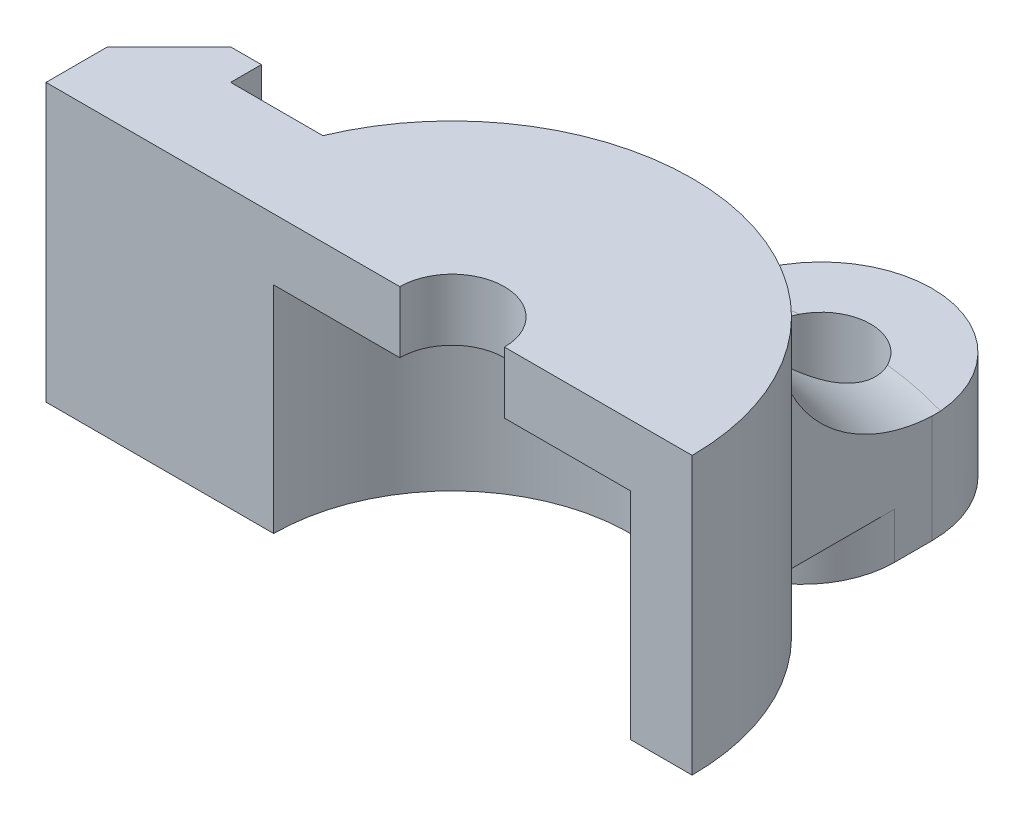
ISO-10303-21;
HEADER;
FILE_DESCRIPTION(('STEP AP214'),'2;1');
FILE_NAME('part.step','',(''),(''),'','','');
FILE_SCHEMA(('AUTOMOTIVE_DESIGN { 1 0 10303 214 1 1 1 1 }'));
ENDSEC;
DATA;
#1=APPLICATION_CONTEXT('core data for automotive mechanical design processes');
#2=APPLICATION_PROTOCOL_DEFINITION('international standard','automotive_design',2000,#1);
#3=PRODUCT_CONTEXT('',#1,'mechanical');
#4=PRODUCT('Part','Part','',(#3));
#5=PRODUCT_RELATED_PRODUCT_CATEGORY('part','',(#4));
#6=PRODUCT_DEFINITION_FORMATION('','',#4);
#7=PRODUCT_DEFINITION_CONTEXT('part definition',#1,'design');
#8=PRODUCT_DEFINITION('design','',#6,#7);
#9=PRODUCT_DEFINITION_SHAPE('','',#8);
#10=(LENGTH_UNIT() NAMED_UNIT(*) SI_UNIT(.MILLI.,.METRE.));
#11=(NAMED_UNIT(*) PLANE_ANGLE_UNIT() SI_UNIT($,.RADIAN.));
#12=(NAMED_UNIT(*) SI_UNIT($,.STERADIAN.) SOLID_ANGLE_UNIT());
#13=UNCERTAINTY_MEASURE_WITH_UNIT(LENGTH_MEASURE(1.E-05),#10,'distance_accuracy_value','');
#14=(GEOMETRIC_REPRESENTATION_CONTEXT(3) GLOBAL_UNCERTAINTY_ASSIGNED_CONTEXT((#13)) GLOBAL_UNIT_ASSIGNED_CONTEXT((#10,
#11,#12)) REPRESENTATION_CONTEXT('',''));
#15=CARTESIAN_POINT('',(0.,0.,0.));
#16=DIRECTION('',(0.,0.,1.));
#17=DIRECTION('',(1.,0.,0.));
#18=AXIS2_PLACEMENT_3D('',#15,#16,#17);
#19=CARTESIAN_POINT('',(0.,7.,0.));
#20=DIRECTION('',(0.,-1.,0.));
#21=DIRECTION('',(0.,0.,-1.));
#22=AXIS2_PLACEMENT_3D('',#19,#20,#21);
#23=CYLINDRICAL_SURFACE('',#22,7.8);
#24=CARTESIAN_POINT('',(0.,0.,0.));
#25=DIRECTION('',(0.,1.,0.));
#26=DIRECTION('',(0.,0.,1.));
#27=AXIS2_PLACEMENT_3D('',#24,#25,#26);
#28=CIRCLE('',#27,7.8);
#29=CARTESIAN_POINT('',(-3.6,0.,-6.91953755680248));
#30=VERTEX_POINT('',#29);
#31=CARTESIAN_POINT('',(-7.2,0.,-3.));
#32=VERTEX_POINT('',#31);
#33=EDGE_CURVE('E206',#30,#32,#28,.T.);
#34=ORIENTED_EDGE('',*,*,#33,.T.);
#35=DIRECTION('',(0.,1.,0.));
#36=VECTOR('',#35,1.);
#37=CARTESIAN_POINT('',(-7.2,-7.21110255092798,-3.));
#38=LINE('',#37,#36);
#39=CARTESIAN_POINT('',(-7.2,9.,-3.));
#40=VERTEX_POINT('',#39);
#41=EDGE_CURVE('E191',#32,#40,#38,.T.);
#42=ORIENTED_EDGE('',*,*,#41,.T.);
#43=CARTESIAN_POINT('',(0.,9.,0.));
#44=DIRECTION('',(0.,1.,0.));
#45=DIRECTION('',(0.,0.,1.));
#46=AXIS2_PLACEMENT_3D('',#43,#44,#45);
#47=CIRCLE('',#46,7.8);
#48=CARTESIAN_POINT('',(7.8,9.,0.));
#49=VERTEX_POINT('',#48);
#50=EDGE_CURVE('E204',#49,#40,#47,.T.);
#51=ORIENTED_EDGE('',*,*,#50,.F.);
#52=DIRECTION('',(0.,-1.,0.));
#53=VECTOR('',#52,1.);
#54=CARTESIAN_POINT('',(7.8,7.,0.));
#55=LINE('',#54,#53);
#56=CARTESIAN_POINT('',(7.8,0.,0.));
#57=VERTEX_POINT('',#56);
#58=EDGE_CURVE('E240',#49,#57,#55,.T.);
#59=ORIENTED_EDGE('',*,*,#58,.T.);
#60=CARTESIAN_POINT('',(3.6,0.,-6.91953755680248));
#61=VERTEX_POINT('',#60);
#62=EDGE_CURVE('E242',#57,#61,#28,.T.);
#63=ORIENTED_EDGE('',*,*,#62,.T.);
#64=DIRECTION('',(0.,-1.,0.));
#65=VECTOR('',#64,1.);
#66=CARTESIAN_POINT('',(3.6,2.,-6.91953755680248));
#67=LINE('',#66,#65);
#68=CARTESIAN_POINT('',(3.6,7.,-6.91953755680248));
#69=VERTEX_POINT('',#68);
#70=EDGE_CURVE('E554',#69,#61,#67,.T.);
#71=ORIENTED_EDGE('',*,*,#70,.F.);
#72=CARTESIAN_POINT('',(0.,7.,0.));
#73=DIRECTION('',(0.,-1.,0.));
#74=DIRECTION('',(0.,0.,-1.));
#75=AXIS2_PLACEMENT_3D('',#72,#73,#74);
#76=CIRCLE('',#75,7.8);
#77=CARTESIAN_POINT('',(-3.6,7.,-6.91953755680248));
#78=VERTEX_POINT('',#77);
#79=EDGE_CURVE('E263',#69,#78,#76,.F.);
#80=ORIENTED_EDGE('',*,*,#79,.T.);
#81=DIRECTION('',(0.,-1.,0.));
#82=VECTOR('',#81,1.);
#83=CARTESIAN_POINT('',(-3.6,2.,-6.91953755680248));
#84=LINE('',#83,#82);
#85=EDGE_CURVE('E230',#78,#30,#84,.T.);
#86=ORIENTED_EDGE('',*,*,#85,.T.);
#87=EDGE_LOOP('',(#34,#42,#51,#59,#63,#71,#80,#86));
#88=FACE_BOUND('',#87,.T.);
#89=ADVANCED_FACE('F45',(#88),#23,.T.);
#90=CARTESIAN_POINT('',(-7.8,7.,0.));
#91=DIRECTION('',(0.,0.,-1.));
#92=DIRECTION('',(-1.,0.,0.));
#93=AXIS2_PLACEMENT_3D('',#90,#91,#92);
#94=PLANE('',#93);
#95=DIRECTION('',(1.,0.,0.));
#96=VECTOR('',#95,1.);
#97=CARTESIAN_POINT('',(-7.8,0.,0.));
#98=LINE('',#97,#96);
#99=CARTESIAN_POINT('',(-13.2,0.,0.));
#100=VERTEX_POINT('',#99);
#101=CARTESIAN_POINT('',(-5.8,0.,0.));
#102=VERTEX_POINT('',#101);
#103=EDGE_CURVE('E245',#100,#102,#98,.T.);
#104=ORIENTED_EDGE('',*,*,#103,.T.);
#105=DIRECTION('',(0.,-1.,0.));
#106=VECTOR('',#105,1.);
#107=CARTESIAN_POINT('',(-5.8,7.,0.));
#108=LINE('',#107,#106);
#109=CARTESIAN_POINT('',(-5.8,7.,0.));
#110=VERTEX_POINT('',#109);
#111=EDGE_CURVE('E255',#110,#102,#108,.T.);
#112=ORIENTED_EDGE('',*,*,#111,.F.);
#113=DIRECTION('',(1.,0.,0.));
#114=VECTOR('',#113,1.);
#115=CARTESIAN_POINT('',(-7.8,7.,0.));
#116=LINE('',#115,#114);
#117=CARTESIAN_POINT('',(-1.7,7.,0.));
#118=VERTEX_POINT('',#117);
#119=EDGE_CURVE('E228',#110,#118,#116,.T.);
#120=ORIENTED_EDGE('',*,*,#119,.T.);
#121=DIRECTION('',(0.,-1.,0.));
#122=VECTOR('',#121,1.);
#123=CARTESIAN_POINT('',(-1.7,9.,0.));
#124=LINE('',#123,#122);
#125=CARTESIAN_POINT('',(-1.7,9.,0.));
#126=VERTEX_POINT('',#125);
#127=EDGE_CURVE('E234',#126,#118,#124,.T.);
#128=ORIENTED_EDGE('',*,*,#127,.F.);
#129=DIRECTION('',(1.,0.,0.));
#130=VECTOR('',#129,1.);
#131=CARTESIAN_POINT('',(-7.8,9.,0.));
#132=LINE('',#131,#130);
#133=CARTESIAN_POINT('',(-13.2,9.,0.));
#134=VERTEX_POINT('',#133);
#135=EDGE_CURVE('E213',#134,#126,#132,.T.);
#136=ORIENTED_EDGE('',*,*,#135,.F.);
#137=DIRECTION('',(0.,1.,0.));
#138=VECTOR('',#137,1.);
#139=CARTESIAN_POINT('',(-13.2,-7.21110255092798,0.));
#140=LINE('',#139,#138);
#141=EDGE_CURVE('E608',#100,#134,#140,.T.);
#142=ORIENTED_EDGE('',*,*,#141,.F.);
#143=EDGE_LOOP('',(#104,#112,#120,#128,#136,#142));
#144=FACE_BOUND('',#143,.T.);
#145=ADVANCED_FACE('F366',(#144),#94,.F.);
#146=CARTESIAN_POINT('',(0.,7.,0.));
#147=DIRECTION('',(0.,-1.,0.));
#148=DIRECTION('',(0.,0.,-1.));
#149=AXIS2_PLACEMENT_3D('',#146,#147,#148);
#150=CYLINDRICAL_SURFACE('',#149,5.8);
#151=CARTESIAN_POINT('',(0.,0.,0.));
#152=DIRECTION('',(0.,-1.,0.));
#153=DIRECTION('',(0.,0.,1.));
#154=AXIS2_PLACEMENT_3D('',#151,#152,#153);
#155=CIRCLE('',#154,5.8);
#156=CARTESIAN_POINT('',(5.8,0.,0.));
#157=VERTEX_POINT('',#156);
#158=EDGE_CURVE('E248',#102,#157,#155,.T.);
#159=ORIENTED_EDGE('',*,*,#158,.T.);
#160=DIRECTION('',(0.,-1.,0.));
#161=VECTOR('',#160,1.);
#162=CARTESIAN_POINT('',(5.8,7.,0.));
#163=LINE('',#162,#161);
#164=CARTESIAN_POINT('',(5.8,7.,0.));
#165=VERTEX_POINT('',#164);
#166=EDGE_CURVE('E252',#165,#157,#163,.T.);
#167=ORIENTED_EDGE('',*,*,#166,.F.);
#168=CARTESIAN_POINT('',(0.,7.,0.));
#169=DIRECTION('',(0.,-1.,0.));
#170=DIRECTION('',(0.,0.,1.));
#171=AXIS2_PLACEMENT_3D('',#168,#169,#170);
#172=CIRCLE('',#171,5.8);
#173=EDGE_CURVE('E237',#110,#165,#172,.T.);
#174=ORIENTED_EDGE('',*,*,#173,.F.);
#175=ORIENTED_EDGE('',*,*,#111,.T.);
#176=EDGE_LOOP('',(#159,#167,#174,#175));
#177=FACE_BOUND('',#176,.T.);
#178=ADVANCED_FACE('F370',(#177),#150,.F.);
#179=CARTESIAN_POINT('',(5.8,7.,0.));
#180=DIRECTION('',(0.,0.,-1.));
#181=DIRECTION('',(-1.,0.,0.));
#182=AXIS2_PLACEMENT_3D('',#179,#180,#181);
#183=PLANE('',#182);
#184=DIRECTION('',(1.,0.,0.));
#185=VECTOR('',#184,1.);
#186=CARTESIAN_POINT('',(5.8,0.,0.));
#187=LINE('',#186,#185);
#188=EDGE_CURVE('E241',#157,#57,#187,.T.);
#189=ORIENTED_EDGE('',*,*,#188,.T.);
#190=ORIENTED_EDGE('',*,*,#58,.F.);
#191=DIRECTION('',(1.,0.,0.));
#192=VECTOR('',#191,1.);
#193=CARTESIAN_POINT('',(7.8,9.,0.));
#194=LINE('',#193,#192);
#195=CARTESIAN_POINT('',(1.7,9.,0.));
#196=VERTEX_POINT('',#195);
#197=EDGE_CURVE('E212',#196,#49,#194,.T.);
#198=ORIENTED_EDGE('',*,*,#197,.F.);
#199=DIRECTION('',(0.,-1.,0.));
#200=VECTOR('',#199,1.);
#201=CARTESIAN_POINT('',(1.7,9.,0.));
#202=LINE('',#201,#200);
#203=CARTESIAN_POINT('',(1.7,7.,0.));
#204=VERTEX_POINT('',#203);
#205=EDGE_CURVE('E227',#196,#204,#202,.T.);
#206=ORIENTED_EDGE('',*,*,#205,.T.);
#207=DIRECTION('',(1.,0.,0.));
#208=VECTOR('',#207,1.);
#209=CARTESIAN_POINT('',(7.8,7.,0.));
#210=LINE('',#209,#208);
#211=EDGE_CURVE('E214',#204,#165,#210,.T.);
#212=ORIENTED_EDGE('',*,*,#211,.T.);
#213=ORIENTED_EDGE('',*,*,#166,.T.);
#214=EDGE_LOOP('',(#189,#190,#198,#206,#212,#213));
#215=FACE_BOUND('',#214,.T.);
#216=ADVANCED_FACE('F376',(#215),#183,.F.);
#217=CARTESIAN_POINT('',(0.,0.,0.));
#218=DIRECTION('',(0.,1.,0.));
#219=DIRECTION('',(0.,0.,1.));
#220=AXIS2_PLACEMENT_3D('',#217,#218,#219);
#221=PLANE('',#220);
#222=ORIENTED_EDGE('',*,*,#62,.F.);
#223=ORIENTED_EDGE('',*,*,#188,.F.);
#224=ORIENTED_EDGE('',*,*,#158,.F.);
#225=ORIENTED_EDGE('',*,*,#103,.F.);
#226=DIRECTION('',(0.,0.,-1.));
#227=VECTOR('',#226,1.);
#228=CARTESIAN_POINT('',(-13.2,0.,-2.));
#229=LINE('',#228,#227);
#230=CARTESIAN_POINT('',(-13.2,0.,-2.));
#231=VERTEX_POINT('',#230);
#232=EDGE_CURVE('E538',#100,#231,#229,.T.);
#233=ORIENTED_EDGE('',*,*,#232,.T.);
#234=DIRECTION('',(0.707106781186547,0.,-0.707106781186548));
#235=VECTOR('',#234,1.);
#236=CARTESIAN_POINT('',(-11.2,0.,-4.));
#237=LINE('',#236,#235);
#238=CARTESIAN_POINT('',(-11.2,0.,-4.));
#239=VERTEX_POINT('',#238);
#240=EDGE_CURVE('E636',#231,#239,#237,.T.);
#241=ORIENTED_EDGE('',*,*,#240,.T.);
#242=DIRECTION('',(1.,0.,0.));
#243=VECTOR('',#242,1.);
#244=CARTESIAN_POINT('',(-10.2,0.,-4.));
#245=LINE('',#244,#243);
#246=CARTESIAN_POINT('',(-10.2,0.,-4.));
#247=VERTEX_POINT('',#246);
#248=EDGE_CURVE('E613',#239,#247,#245,.T.);
#249=ORIENTED_EDGE('',*,*,#248,.T.);
#250=DIRECTION('',(0.,0.,1.));
#251=VECTOR('',#250,1.);
#252=CARTESIAN_POINT('',(-10.2,0.,-4.));
#253=LINE('',#252,#251);
#254=CARTESIAN_POINT('',(-10.2,0.,-3.));
#255=VERTEX_POINT('',#254);
#256=EDGE_CURVE('E610',#247,#255,#253,.T.);
#257=ORIENTED_EDGE('',*,*,#256,.T.);
#258=DIRECTION('',(1.,0.,0.));
#259=VECTOR('',#258,1.);
#260=CARTESIAN_POINT('',(-10.2,0.,-3.));
#261=LINE('',#260,#259);
#262=EDGE_CURVE('E533',#255,#32,#261,.T.);
#263=ORIENTED_EDGE('',*,*,#262,.T.);
#264=ORIENTED_EDGE('',*,*,#33,.F.);
#265=DIRECTION('',(0.,0.,1.));
#266=VECTOR('',#265,1.);
#267=CARTESIAN_POINT('',(-3.6,0.,0.));
#268=LINE('',#267,#266);
#269=CARTESIAN_POINT('',(-3.6,0.,-10.7833204533669));
#270=VERTEX_POINT('',#269);
#271=EDGE_CURVE('E66',#270,#30,#268,.T.);
#272=ORIENTED_EDGE('',*,*,#271,.F.);
#273=CARTESIAN_POINT('',(-0.600000000000001,0.,-10.7833204533669));
#274=DIRECTION('',(0.,1.,0.));
#275=DIRECTION('',(0.,0.,1.));
#276=AXIS2_PLACEMENT_3D('',#273,#274,#275);
#277=CIRCLE('',#276,3.);
#278=CARTESIAN_POINT('',(-0.433333333333334,0.,-7.78795366076495));
#279=VERTEX_POINT('',#278);
#280=EDGE_CURVE('E11',#270,#279,#277,.T.);
#281=ORIENTED_EDGE('',*,*,#280,.T.);
#282=CARTESIAN_POINT('',(0.433333333333334,0.,-7.78795366076495));
#283=VERTEX_POINT('',#282);
#284=EDGE_CURVE('E246',#283,#279,#28,.T.);
#285=ORIENTED_EDGE('',*,*,#284,.F.);
#286=CARTESIAN_POINT('',(0.600000000000001,0.,-10.7833204533669));
#287=DIRECTION('',(0.,1.,0.));
#288=DIRECTION('',(0.,0.,1.));
#289=AXIS2_PLACEMENT_3D('',#286,#287,#288);
#290=CIRCLE('',#289,3.);
#291=CARTESIAN_POINT('',(3.6,0.,-10.7833204533669));
#292=VERTEX_POINT('',#291);
#293=EDGE_CURVE('E53',#283,#292,#290,.T.);
#294=ORIENTED_EDGE('',*,*,#293,.T.);
#295=DIRECTION('',(0.,0.,-1.));
#296=VECTOR('',#295,1.);
#297=CARTESIAN_POINT('',(3.6,0.,0.));
#298=LINE('',#297,#296);
#299=EDGE_CURVE('E60',#61,#292,#298,.T.);
#300=ORIENTED_EDGE('',*,*,#299,.F.);
#301=EDGE_LOOP('',(#222,#223,#224,#225,#233,#241,#249,#257,#263,#264,#272,#281,#285,#294,#300));
#302=FACE_BOUND('',#301,.T.);
#303=ADVANCED_FACE('F382',(#302),#221,.F.);
#304=CARTESIAN_POINT('',(0.,7.,0.));
#305=DIRECTION('',(0.,1.,0.));
#306=DIRECTION('',(0.,0.,1.));
#307=AXIS2_PLACEMENT_3D('',#304,#305,#306);
#308=PLANE('',#307);
#309=ORIENTED_EDGE('',*,*,#119,.F.);
#310=ORIENTED_EDGE('',*,*,#173,.T.);
#311=ORIENTED_EDGE('',*,*,#211,.F.);
#312=CARTESIAN_POINT('',(0.,7.,0.));
#313=DIRECTION('',(0.,-1.,0.));
#314=DIRECTION('',(0.,0.,1.));
#315=AXIS2_PLACEMENT_3D('',#312,#313,#314);
#316=CIRCLE('',#315,1.7);
#317=EDGE_CURVE('E219',#118,#204,#316,.T.);
#318=ORIENTED_EDGE('',*,*,#317,.F.);
#319=EDGE_LOOP('',(#309,#310,#311,#318));
#320=FACE_BOUND('',#319,.T.);
#321=ADVANCED_FACE('F385',(#320),#308,.F.);
#322=CARTESIAN_POINT('',(0.,9.,0.));
#323=DIRECTION('',(0.,-1.,0.));
#324=DIRECTION('',(0.,0.,-1.));
#325=AXIS2_PLACEMENT_3D('',#322,#323,#324);
#326=CYLINDRICAL_SURFACE('',#325,1.7);
#327=ORIENTED_EDGE('',*,*,#317,.T.);
#328=ORIENTED_EDGE('',*,*,#205,.F.);
#329=CARTESIAN_POINT('',(0.,9.,0.));
#330=DIRECTION('',(0.,-1.,0.));
#331=DIRECTION('',(0.,0.,1.));
#332=AXIS2_PLACEMENT_3D('',#329,#330,#331);
#333=CIRCLE('',#332,1.7);
#334=EDGE_CURVE('E216',#126,#196,#333,.T.);
#335=ORIENTED_EDGE('',*,*,#334,.F.);
#336=ORIENTED_EDGE('',*,*,#127,.T.);
#337=EDGE_LOOP('',(#327,#328,#335,#336));
#338=FACE_BOUND('',#337,.T.);
#339=ADVANCED_FACE('F386',(#338),#326,.F.);
#340=CARTESIAN_POINT('',(0.,9.,0.));
#341=DIRECTION('',(0.,1.,0.));
#342=DIRECTION('',(0.,0.,1.));
#343=AXIS2_PLACEMENT_3D('',#340,#341,#342);
#344=PLANE('',#343);
#345=ORIENTED_EDGE('',*,*,#50,.T.);
#346=DIRECTION('',(-1.,0.,0.));
#347=VECTOR('',#346,1.);
#348=CARTESIAN_POINT('',(-10.2,9.,-3.));
#349=LINE('',#348,#347);
#350=CARTESIAN_POINT('',(-10.2,9.,-3.));
#351=VERTEX_POINT('',#350);
#352=EDGE_CURVE('E187',#40,#351,#349,.T.);
#353=ORIENTED_EDGE('',*,*,#352,.T.);
#354=DIRECTION('',(0.,0.,-1.));
#355=VECTOR('',#354,1.);
#356=CARTESIAN_POINT('',(-10.2,9.,-4.));
#357=LINE('',#356,#355);
#358=CARTESIAN_POINT('',(-10.2,9.,-4.));
#359=VERTEX_POINT('',#358);
#360=EDGE_CURVE('E199',#351,#359,#357,.T.);
#361=ORIENTED_EDGE('',*,*,#360,.T.);
#362=DIRECTION('',(-1.,0.,0.));
#363=VECTOR('',#362,1.);
#364=CARTESIAN_POINT('',(-10.2,9.,-4.));
#365=LINE('',#364,#363);
#366=CARTESIAN_POINT('',(-11.2,9.,-4.));
#367=VERTEX_POINT('',#366);
#368=EDGE_CURVE('E628',#359,#367,#365,.T.);
#369=ORIENTED_EDGE('',*,*,#368,.T.);
#370=DIRECTION('',(-0.707106781186547,0.,0.707106781186548));
#371=VECTOR('',#370,1.);
#372=CARTESIAN_POINT('',(-11.2,9.,-4.));
#373=LINE('',#372,#371);
#374=CARTESIAN_POINT('',(-13.2,9.,-2.));
#375=VERTEX_POINT('',#374);
#376=EDGE_CURVE('E631',#367,#375,#373,.T.);
#377=ORIENTED_EDGE('',*,*,#376,.T.);
#378=DIRECTION('',(0.,0.,1.));
#379=VECTOR('',#378,1.);
#380=CARTESIAN_POINT('',(-13.2,9.,-2.));
#381=LINE('',#380,#379);
#382=EDGE_CURVE('E207',#375,#134,#381,.T.);
#383=ORIENTED_EDGE('',*,*,#382,.T.);
#384=ORIENTED_EDGE('',*,*,#135,.T.);
#385=ORIENTED_EDGE('',*,*,#334,.T.);
#386=ORIENTED_EDGE('',*,*,#197,.T.);
#387=EDGE_LOOP('',(#345,#353,#361,#369,#377,#383,#384,#385,#386));
#388=FACE_BOUND('',#387,.T.);
#389=ADVANCED_FACE('F210',(#388),#344,.T.);
#390=CARTESIAN_POINT('',(0.,2.,0.));
#391=DIRECTION('',(0.,-1.,0.));
#392=DIRECTION('',(0.,0.,-1.));
#393=AXIS2_PLACEMENT_3D('',#390,#391,#392);
#394=CYLINDRICAL_SURFACE('',#393,7.8);
#395=CARTESIAN_POINT('',(0.,-1.5,0.));
#396=DIRECTION('',(0.,-1.,0.));
#397=DIRECTION('',(0.,0.,-1.));
#398=AXIS2_PLACEMENT_3D('',#395,#396,#397);
#399=CIRCLE('',#398,7.8);
#400=CARTESIAN_POINT('',(-0.433333333333334,-1.5,-7.78795366076495));
#401=VERTEX_POINT('',#400);
#402=CARTESIAN_POINT('',(0.433333333333334,-1.5,-7.78795366076495));
#403=VERTEX_POINT('',#402);
#404=EDGE_CURVE('E546',#401,#403,#399,.T.);
#405=ORIENTED_EDGE('',*,*,#404,.T.);
#406=DIRECTION('',(0.,-1.,0.));
#407=VECTOR('',#406,1.);
#408=CARTESIAN_POINT('',(0.433333333333334,2.,-7.78795366076495));
#409=LINE('',#408,#407);
#410=EDGE_CURVE('E577',#403,#283,#409,.F.);
#411=ORIENTED_EDGE('',*,*,#410,.T.);
#412=ORIENTED_EDGE('',*,*,#284,.T.);
#413=DIRECTION('',(0.,-1.,0.));
#414=VECTOR('',#413,1.);
#415=CARTESIAN_POINT('',(-0.433333333333334,2.,-7.78795366076495));
#416=LINE('',#415,#414);
#417=EDGE_CURVE('E571',#279,#401,#416,.T.);
#418=ORIENTED_EDGE('',*,*,#417,.T.);
#419=EDGE_LOOP('',(#405,#411,#412,#418));
#420=FACE_BOUND('',#419,.T.);
#421=ADVANCED_FACE('F321',(#420),#394,.F.);
#422=CARTESIAN_POINT('',(-3.6,2.,0.));
#423=DIRECTION('',(1.,0.,0.));
#424=DIRECTION('',(0.,0.,-1.));
#425=AXIS2_PLACEMENT_3D('',#422,#423,#424);
#426=PLANE('',#425);
#427=DIRECTION('',(0.,0.,1.));
#428=VECTOR('',#427,1.);
#429=CARTESIAN_POINT('',(-3.6,-1.5,0.));
#430=LINE('',#429,#428);
#431=CARTESIAN_POINT('',(-3.6,-1.5,-12.));
#432=VERTEX_POINT('',#431);
#433=CARTESIAN_POINT('',(-3.6,-1.5,-10.7833204533669));
#434=VERTEX_POINT('',#433);
#435=EDGE_CURVE('E532',#432,#434,#430,.T.);
#436=ORIENTED_EDGE('',*,*,#435,.T.);
#437=DIRECTION('',(0.,-1.,0.));
#438=VECTOR('',#437,1.);
#439=CARTESIAN_POINT('',(-3.6,2.,-10.7833204533669));
#440=LINE('',#439,#438);
#441=EDGE_CURVE('E580',#434,#270,#440,.F.);
#442=ORIENTED_EDGE('',*,*,#441,.T.);
#443=ORIENTED_EDGE('',*,*,#271,.T.);
#444=ORIENTED_EDGE('',*,*,#85,.F.);
#445=CARTESIAN_POINT('',(-3.6,7.,-6.91953755680248));
#446=CARTESIAN_POINT('',(-3.6,6.8687690737443,-6.91950567284725));
#447=CARTESIAN_POINT('',(-3.6,6.73755083888044,-6.92536013367552));
#448=CARTESIAN_POINT('',(-3.6,6.47619392966398,-6.9486025719701));
#449=CARTESIAN_POINT('',(-3.6,6.34605482017702,-6.96598564636697));
#450=CARTESIAN_POINT('',(-3.6,6.08837602610761,-7.01194325735084));
#451=CARTESIAN_POINT('',(-3.6,5.9608273031768,-7.04046726874671));
#452=CARTESIAN_POINT('',(-3.6,5.70862488393409,-7.1082846052358));
#453=CARTESIAN_POINT('',(-3.6,5.58397139081613,-7.1475786837348));
#454=CARTESIAN_POINT('',(-3.6,5.33857007548336,-7.23634733064854));
#455=CARTESIAN_POINT('',(-3.6,5.21781632447883,-7.28580551312741));
#456=CARTESIAN_POINT('',(-3.6,4.98069770888505,-7.39434728196256));
#457=CARTESIAN_POINT('',(-3.6,4.86433452273349,-7.45343450433043));
#458=CARTESIAN_POINT('',(-3.6,4.52266965884873,-7.64429225401439));
#459=CARTESIAN_POINT('',(-3.6,4.30480313384272,-7.78965502049812));
#460=CARTESIAN_POINT('',(-3.6,3.88079339380374,-8.12117773129626));
#461=CARTESIAN_POINT('',(-3.6,3.67619545794688,-8.30929706431297));
#462=CARTESIAN_POINT('',(-3.6,3.29809893788453,-8.71459933684407));
#463=CARTESIAN_POINT('',(-3.6,3.12461194985302,-8.93179306097124));
#464=CARTESIAN_POINT('',(-3.6,2.79746497338993,-9.41099804964583));
#465=CARTESIAN_POINT('',(-3.6,2.64715497810478,-9.67529930875993));
#466=CARTESIAN_POINT('',(-3.6,2.39136179962235,-10.2246866224576));
#467=CARTESIAN_POINT('',(-3.6,2.28585697500154,-10.5097625644886));
#468=CARTESIAN_POINT('',(-3.6,2.14953991359685,-10.9968852613042));
#469=CARTESIAN_POINT('',(-3.6,2.10557145204241,-11.1953454023165));
#470=CARTESIAN_POINT('',(-3.6,2.03977485747129,-11.59564100806));
#471=CARTESIAN_POINT('',(-3.6,2.01791887360574,-11.797471900614));
#472=CARTESIAN_POINT('',(-3.6,2.00738385676086,-12.));
#473=B_SPLINE_CURVE_WITH_KNOTS('',3,(#445,#446,#447,#448,#449,#450,#451,#452,#453,#454,#455,
#456,#457,#458,#459,#460,#461,#462,#463,#464,#465,#466,#467,#468,#469,#470,#471,#472),
.UNSPECIFIED.,.F.,.F.,(4,2,2,2,2,2,2,2,2,2,2,2,2,4),(0.,0.393542290880505,0.786917317166907,
1.17852868674321,1.57016745796882,1.96117973791321,2.35234001118146,3.13469360207407,
3.96516742120394,4.79595014741847,5.70408483200675,6.61178037660279,7.22044250281973,
7.82833705609297),.UNSPECIFIED.);
#474=CARTESIAN_POINT('',(-3.6,2.00738385676086,-12.));
#475=VERTEX_POINT('',#474);
#476=EDGE_CURVE('E305',#78,#475,#473,.T.);
#477=ORIENTED_EDGE('',*,*,#476,.T.);
#478=DIRECTION('',(0.,-1.,0.));
#479=VECTOR('',#478,1.);
#480=CARTESIAN_POINT('',(-3.6,2.,-12.));
#481=LINE('',#480,#479);
#482=EDGE_CURVE('E222',#475,#432,#481,.T.);
#483=ORIENTED_EDGE('',*,*,#482,.T.);
#484=EDGE_LOOP('',(#436,#442,#443,#444,#477,#483));
#485=FACE_BOUND('',#484,.T.);
#486=ADVANCED_FACE('F317',(#485),#426,.F.);
#487=CARTESIAN_POINT('',(3.6,2.,0.));
#488=DIRECTION('',(1.,0.,0.));
#489=DIRECTION('',(0.,0.,-1.));
#490=AXIS2_PLACEMENT_3D('',#487,#488,#489);
#491=PLANE('',#490);
#492=ORIENTED_EDGE('',*,*,#299,.T.);
#493=DIRECTION('',(0.,1.,0.));
#494=VECTOR('',#493,1.);
#495=CARTESIAN_POINT('',(3.6,-1.5,-10.7833204533669));
#496=LINE('',#495,#494);
#497=CARTESIAN_POINT('',(3.6,-1.5,-10.7833204533669));
#498=VERTEX_POINT('',#497);
#499=EDGE_CURVE('E569',#292,#498,#496,.F.);
#500=ORIENTED_EDGE('',*,*,#499,.T.);
#501=DIRECTION('',(0.,0.,1.));
#502=VECTOR('',#501,1.);
#503=CARTESIAN_POINT('',(3.6,-1.5,0.));
#504=LINE('',#503,#502);
#505=CARTESIAN_POINT('',(3.6,-1.5,-12.));
#506=VERTEX_POINT('',#505);
#507=EDGE_CURVE('E543',#506,#498,#504,.T.);
#508=ORIENTED_EDGE('',*,*,#507,.F.);
#509=DIRECTION('',(0.,-1.,0.));
#510=VECTOR('',#509,1.);
#511=CARTESIAN_POINT('',(3.6,2.,-12.));
#512=LINE('',#511,#510);
#513=CARTESIAN_POINT('',(3.6,2.00738385676086,-12.));
#514=VERTEX_POINT('',#513);
#515=EDGE_CURVE('E555',#514,#506,#512,.T.);
#516=ORIENTED_EDGE('',*,*,#515,.F.);
#517=CARTESIAN_POINT('',(3.6,2.00738385676086,-12.));
#518=CARTESIAN_POINT('',(3.6,2.01549098341776,-11.8441661493082));
#519=CARTESIAN_POINT('',(3.6,2.030306365497,-11.6886935795519));
#520=CARTESIAN_POINT('',(3.6,2.07307522878406,-11.3795886551856));
#521=CARTESIAN_POINT('',(3.6,2.10102669774833,-11.2259560224212));
#522=CARTESIAN_POINT('',(3.6,2.16976875678274,-10.9217029917411));
#523=CARTESIAN_POINT('',(3.6,2.21055066403767,-10.7710806297657));
#524=CARTESIAN_POINT('',(3.6,2.3046027710494,-10.4737840400305));
#525=CARTESIAN_POINT('',(3.6,2.35787327368715,-10.3271099081219));
#526=CARTESIAN_POINT('',(3.6,2.47648327099278,-10.0387614424123));
#527=CARTESIAN_POINT('',(3.6,2.54182027889337,-9.89708608557398));
#528=CARTESIAN_POINT('',(3.6,2.68414138286701,-9.61964888576215));
#529=CARTESIAN_POINT('',(3.6,2.76112948257133,-9.48388909627126));
#530=CARTESIAN_POINT('',(3.6,2.92624213888515,-9.21931572296553));
#531=CARTESIAN_POINT('',(3.6,3.01436675770138,-9.09050217795698));
#532=CARTESIAN_POINT('',(3.6,3.20121474144541,-8.84080747118913));
#533=CARTESIAN_POINT('',(3.6,3.29993776131201,-8.71992605138318));
#534=CARTESIAN_POINT('',(3.6,3.5075847020557,-8.48688612126945));
#535=CARTESIAN_POINT('',(3.6,3.61652580559549,-8.37474290635712));
#536=CARTESIAN_POINT('',(3.6,3.84377969211313,-8.16048209644511));
#537=CARTESIAN_POINT('',(3.6,3.96208840512935,-8.05836019018905));
#538=CARTESIAN_POINT('',(3.6,4.20748428330544,-7.86508399950196));
#539=CARTESIAN_POINT('',(3.6,4.33457700647717,-7.77393676107768));
#540=CARTESIAN_POINT('',(3.6,4.59658757137503,-7.60382187745229));
#541=CARTESIAN_POINT('',(3.6,4.73150104617217,-7.52484752363867));
#542=CARTESIAN_POINT('',(3.6,5.00003805568904,-7.38441334676096));
#543=CARTESIAN_POINT('',(3.6,5.13326351007367,-7.32219254043109));
#544=CARTESIAN_POINT('',(3.6,5.40483579191246,-7.21035962129148));
#545=CARTESIAN_POINT('',(3.6,5.54317970871157,-7.16074046496887));
#546=CARTESIAN_POINT('',(3.6,5.82365509071613,-7.07496040644152));
#547=CARTESIAN_POINT('',(3.6,5.96577770332935,-7.0387705873123));
#548=CARTESIAN_POINT('',(3.6,6.25279334058853,-6.9803642318504));
#549=CARTESIAN_POINT('',(3.6,6.39768429351423,-6.95813763785315));
#550=CARTESIAN_POINT('',(3.6,6.61917931709081,-6.93524839140377));
#551=CARTESIAN_POINT('',(3.6,6.6952755365583,-6.9293564085573));
#552=CARTESIAN_POINT('',(3.6,6.84757707030837,-6.92150257113929));
#553=CARTESIAN_POINT('',(3.6,6.92378213725713,-6.91953591761962));
#554=CARTESIAN_POINT('',(3.6,7.,-6.91953755680248));
#555=B_SPLINE_CURVE_WITH_KNOTS('',3,(#517,#518,#519,#520,#521,#522,#523,#524,#525,#526,#527,
#528,#529,#530,#531,#532,#533,#534,#535,#536,#537,#538,#539,#540,#541,#542,#543,#544,#545,#546,
#547,#548,#549,#550,#551,#552,#553,#554),.UNSPECIFIED.,.F.,.F.,(4,2,2,2,2,2,2,2,2,2,2,2,2,2,2,2,
2,2,4),(0.,0.467973049661953,0.935874436508843,1.40345985645214,1.87105661773278,
2.33855712004423,2.80621863451764,3.27388276138508,3.74153166672659,4.20998156972218,
4.67822904964964,5.14677557086076,5.61506294041774,6.05557603410509,6.49584236468377,
6.93515510707712,7.37415105005329,7.60303401391561,7.83163698294957),.UNSPECIFIED.);
#556=EDGE_CURVE('E298',#514,#69,#555,.T.);
#557=ORIENTED_EDGE('',*,*,#556,.T.);
#558=ORIENTED_EDGE('',*,*,#70,.T.);
#559=EDGE_LOOP('',(#492,#500,#508,#516,#557,#558));
#560=FACE_BOUND('',#559,.T.);
#561=ADVANCED_FACE('F320',(#560),#491,.T.);
#562=CARTESIAN_POINT('',(0.,2.,-12.));
#563=DIRECTION('',(0.,-1.,0.));
#564=DIRECTION('',(0.,0.,-1.));
#565=AXIS2_PLACEMENT_3D('',#562,#563,#564);
#566=CYLINDRICAL_SURFACE('',#565,1.6);
#567=CARTESIAN_POINT('',(0.,2.,-12.));
#568=DIRECTION('',(0.,-1.,0.));
#569=DIRECTION('',(0.,0.,-1.));
#570=AXIS2_PLACEMENT_3D('',#567,#568,#569);
#571=CIRCLE('',#570,1.6);
#572=CARTESIAN_POINT('',(-1.42884568795934,2.,-12.72));
#573=VERTEX_POINT('',#572);
#574=CARTESIAN_POINT('',(1.42884568795934,2.,-12.72));
#575=VERTEX_POINT('',#574);
#576=EDGE_CURVE('E528',#573,#575,#571,.T.);
#577=ORIENTED_EDGE('',*,*,#576,.F.);
#578=CARTESIAN_POINT('',(-1.42884568795934,2.,-12.72));
#579=CARTESIAN_POINT('',(-1.44839499670953,1.99999932876585,-12.6812048151067));
#580=CARTESIAN_POINT('',(-1.46635411809262,2.00039740488078,-12.6416296134959));
#581=CARTESIAN_POINT('',(-1.49899243071172,2.00209722221955,-12.56116706325));
#582=CARTESIAN_POINT('',(-1.51367153856851,2.00339898641203,-12.520279681289));
#583=CARTESIAN_POINT('',(-1.55258006176748,2.00881097179904,-12.396209300182));
#584=CARTESIAN_POINT('',(-1.57176893369431,2.01442694366375,-12.3114423932851));
#585=CARTESIAN_POINT('',(-1.59618369408897,2.03021886820681,-12.1403055143952));
#586=CARTESIAN_POINT('',(-1.60139742823823,2.04039878121657,-12.0539342127277));
#587=CARTESIAN_POINT('',(-1.59796466545536,2.06543437050239,-11.8821736974492));
#588=CARTESIAN_POINT('',(-1.58932144703412,2.0802889401013,-11.796784256347));
#589=CARTESIAN_POINT('',(-1.55875168688479,2.11438420460334,-11.6290767076602));
#590=CARTESIAN_POINT('',(-1.53678577939251,2.13363779219358,-11.5467684725882));
#591=CARTESIAN_POINT('',(-1.48051651260511,2.17573560537996,-11.3874515856647));
#592=CARTESIAN_POINT('',(-1.44620768602295,2.19858141962183,-11.3104453003449));
#593=CARTESIAN_POINT('',(-1.36415454996407,2.24806846218342,-11.1592325079751));
#594=CARTESIAN_POINT('',(-1.31576832160064,2.2748502168439,-11.0854208660552));
#595=CARTESIAN_POINT('',(-1.20778293573209,2.32946482813826,-10.9469183245721));
#596=CARTESIAN_POINT('',(-1.14817746516632,2.35729826947338,-10.8822325961831));
#597=CARTESIAN_POINT('',(-1.01463089303424,2.41380487023197,-10.7593158009502));
#598=CARTESIAN_POINT('',(-0.940000601638004,2.44241102497895,-10.7017987596611));
#599=CARTESIAN_POINT('',(-0.780747251318977,2.49562959207625,-10.6002340743626));
#600=CARTESIAN_POINT('',(-0.696125580742618,2.52024255817207,-10.5561845620265));
#601=CARTESIAN_POINT('',(-0.522145655399368,2.56149735704212,-10.4847904374865));
#602=CARTESIAN_POINT('',(-0.433087517280683,2.57840542007153,-10.4568771240638));
#603=CARTESIAN_POINT('',(-0.250300644787328,2.6029302178305,-10.41694617919));
#604=CARTESIAN_POINT('',(-0.15658040050853,2.61056324177253,-10.4049006768844));
#605=CARTESIAN_POINT('',(0.0179578720427469,2.61487417755222,-10.3980744466211));
#606=CARTESIAN_POINT('',(0.0986603675873094,2.61298974384755,-10.4010283841923));
#607=CARTESIAN_POINT('',(0.258194557305134,2.6017701906909,-10.4189315905955));
#608=CARTESIAN_POINT('',(0.337025913640034,2.59243373613975,-10.4338830088908));
#609=CARTESIAN_POINT('',(0.487627278369277,2.56798523193776,-10.4741991694583));
#610=CARTESIAN_POINT('',(0.559552544849467,2.5531110131161,-10.4991379320302));
#611=CARTESIAN_POINT('',(0.698294960367035,2.51906558011962,-10.5584447527879));
#612=CARTESIAN_POINT('',(0.765110475590317,2.49989299920803,-10.5928158109119));
#613=CARTESIAN_POINT('',(0.900580933575962,2.45626232966383,-10.6748669749787));
#614=CARTESIAN_POINT('',(0.968440407457927,2.43144377392682,-10.7236676761915));
#615=CARTESIAN_POINT('',(1.09549417700689,2.380391258768,-10.8308928868294));
#616=CARTESIAN_POINT('',(1.15468289320294,2.35415640271104,-10.8893235420157));
#617=CARTESIAN_POINT('',(1.26983480509837,2.29898807936069,-11.0221820427256));
#618=CARTESIAN_POINT('',(1.32458934936512,2.27010226230935,-11.0976844651329));
#619=CARTESIAN_POINT('',(1.42049064166401,2.21494718250435,-11.2577682279092));
#620=CARTESIAN_POINT('',(1.46163789187254,2.18867782321547,-11.3423492330811));
#621=CARTESIAN_POINT('',(1.52849951870257,2.14060611453729,-11.5178793824766));
#622=CARTESIAN_POINT('',(1.55432365854722,2.11877274972861,-11.608777892608));
#623=CARTESIAN_POINT('',(1.58960353372914,2.0804611074706,-11.794797912024));
#624=CARTESIAN_POINT('',(1.59906522598077,2.06398088293186,-11.8899178715063));
#625=CARTESIAN_POINT('',(1.60074054103329,2.03781362070102,-12.0741726888251));
#626=CARTESIAN_POINT('',(1.59415530333162,2.02772059367525,-12.163241301635));
#627=CARTESIAN_POINT('',(1.56612301644579,2.01235771461035,-12.3393927491095));
#628=CARTESIAN_POINT('',(1.54469302851072,2.00708234170379,-12.4264777450111));
#629=CARTESIAN_POINT('',(1.50408982100682,2.00254740842123,-12.5469469348578));
#630=CARTESIAN_POINT('',(1.49074648897687,2.0015730405172,-12.5823288291075));
#631=CARTESIAN_POINT('',(1.46161375836567,2.00030017235502,-12.6520005390814));
#632=CARTESIAN_POINT('',(1.44582930212513,2.00000032511016,-12.686292396231));
#633=CARTESIAN_POINT('',(1.42884568795939,1.99999999999996,-12.72));
#634=B_SPLINE_CURVE_WITH_KNOTS('',3,(#578,#579,#580,#581,#582,#583,#584,#585,#586,#587,#588,
#589,#590,#591,#592,#593,#594,#595,#596,#597,#598,#599,#600,#601,#602,#603,#604,#605,#606,#607,
#608,#609,#610,#611,#612,#613,#614,#615,#616,#617,#618,#619,#620,#621,#622,#623,#624,#625,#626,
#627,#628,#629,#630,#631,#632,#633),.UNSPECIFIED.,.F.,.F.,(4,2,2,2,2,2,2,2,2,2,2,2,2,2,2,2,2,2,
2,2,2,2,2,2,2,2,2,4),(0.,0.130250433252559,0.260504177145424,0.520429371727478,
0.780580552641244,1.0406701916964,1.30153211093309,1.56250972132315,1.83802392797184,
2.11369363228914,2.40767218827941,2.70160994261464,2.98443254874162,3.26675772869677,
3.5078338706,3.74895321324467,3.98072891242355,4.21257841338422,4.47311741379454,
4.73382333663621,5.02535159069107,5.31686908471199,5.60627233628549,5.89557020548343,
6.16388691828522,6.43189576202062,6.545294770114,6.65846712381961),.UNSPECIFIED.);
#635=EDGE_CURVE('E266',#573,#575,#634,.T.);
#636=ORIENTED_EDGE('',*,*,#635,.T.);
#637=EDGE_LOOP('',(#577,#636));
#638=FACE_BOUND('',#637,.T.);
#639=CARTESIAN_POINT('',(0.,-1.5,-12.));
#640=DIRECTION('',(0.,-1.,0.));
#641=DIRECTION('',(0.,0.,-1.));
#642=AXIS2_PLACEMENT_3D('',#639,#640,#641);
#643=CIRCLE('',#642,1.6);
#644=CARTESIAN_POINT('',(0.,-1.5,-13.6));
#645=VERTEX_POINT('',#644);
#646=EDGE_CURVE('E531',#645,#645,#643,.T.);
#647=ORIENTED_EDGE('',*,*,#646,.T.);
#648=EDGE_LOOP('',(#647));
#649=FACE_BOUND('',#648,.T.);
#650=ADVANCED_FACE('F281',(#638,#649),#566,.F.);
#651=CARTESIAN_POINT('',(0.,2.,-12.));
#652=DIRECTION('',(0.,-1.,0.));
#653=DIRECTION('',(0.,0.,-1.));
#654=AXIS2_PLACEMENT_3D('',#651,#652,#653);
#655=CYLINDRICAL_SURFACE('',#654,3.6);
#656=ORIENTED_EDGE('',*,*,#515,.T.);
#657=CARTESIAN_POINT('',(0.,-1.5,-12.));
#658=DIRECTION('',(0.,-1.,0.));
#659=DIRECTION('',(0.,0.,-1.));
#660=AXIS2_PLACEMENT_3D('',#657,#658,#659);
#661=CIRCLE('',#660,3.6);
#662=EDGE_CURVE('E536',#432,#506,#661,.T.);
#663=ORIENTED_EDGE('',*,*,#662,.F.);
#664=ORIENTED_EDGE('',*,*,#482,.F.);
#665=CARTESIAN_POINT('',(-3.6,2.00738385676086,-12.));
#666=CARTESIAN_POINT('',(-3.60000052032287,2.00490760827255,-12.0478216839527));
#667=CARTESIAN_POINT('',(-3.599048136645,2.00305416263009,-12.095621409812));
#668=CARTESIAN_POINT('',(-3.59523756048852,2.00059287652062,-12.191176965386));
#669=CARTESIAN_POINT('',(-3.59237936721044,1.99998503657613,-12.2389327950823));
#670=CARTESIAN_POINT('',(-3.58856826913217,2.,-12.2866666666667));
#671=B_SPLINE_CURVE_WITH_KNOTS('',3,(#665,#666,#667,#668,#669,#670),.UNSPECIFIED.,.F.,.F.,(4,2,
4),(0.,0.143535378178377,0.287070816567992),.UNSPECIFIED.);
#672=CARTESIAN_POINT('',(-3.58856826913216,2.,-12.2866666666667));
#673=VERTEX_POINT('',#672);
#674=EDGE_CURVE('E311',#475,#673,#671,.T.);
#675=ORIENTED_EDGE('',*,*,#674,.T.);
#676=CARTESIAN_POINT('',(0.,2.,-12.));
#677=DIRECTION('',(0.,-1.,0.));
#678=DIRECTION('',(0.,0.,-1.));
#679=AXIS2_PLACEMENT_3D('',#676,#677,#678);
#680=CIRCLE('',#679,3.6);
#681=CARTESIAN_POINT('',(3.58856826913217,2.,-12.2866666666667));
#682=VERTEX_POINT('',#681);
#683=EDGE_CURVE('E550',#673,#682,#680,.T.);
#684=ORIENTED_EDGE('',*,*,#683,.T.);
#685=CARTESIAN_POINT('',(3.58856826913217,2.,-12.2866666666667));
#686=CARTESIAN_POINT('',(3.59237936721045,1.99998503657613,-12.2389327950823));
#687=CARTESIAN_POINT('',(3.59523756048852,2.00059287652062,-12.191176965386));
#688=CARTESIAN_POINT('',(3.599048136645,2.00305416263009,-12.095621409812));
#689=CARTESIAN_POINT('',(3.60000052032288,2.00490760827255,-12.0478216839527));
#690=CARTESIAN_POINT('',(3.6,2.00738385676086,-12.));
#691=B_SPLINE_CURVE_WITH_KNOTS('',3,(#685,#686,#687,#688,#689,#690),.UNSPECIFIED.,.F.,.F.,(4,2,
4),(0.,0.143535438389615,0.287070816567992),.UNSPECIFIED.);
#692=EDGE_CURVE('E274',#682,#514,#691,.T.);
#693=ORIENTED_EDGE('',*,*,#692,.T.);
#694=EDGE_LOOP('',(#656,#663,#664,#675,#684,#693));
#695=FACE_BOUND('',#694,.T.);
#696=ADVANCED_FACE('F323',(#695),#655,.T.);
#697=CARTESIAN_POINT('',(0.,2.,0.));
#698=DIRECTION('',(0.,-1.,0.));
#699=DIRECTION('',(0.,0.,-1.));
#700=AXIS2_PLACEMENT_3D('',#697,#698,#699);
#701=PLANE('',#700);
#702=ORIENTED_EDGE('',*,*,#683,.F.);
#703=CARTESIAN_POINT('',(0.,2.,0.));
#704=DIRECTION('',(0.,-1.,0.));
#705=DIRECTION('',(0.,0.,-1.));
#706=AXIS2_PLACEMENT_3D('',#703,#704,#705);
#707=CIRCLE('',#706,12.8);
#708=EDGE_CURVE('E260',#673,#573,#707,.T.);
#709=ORIENTED_EDGE('',*,*,#708,.T.);
#710=ORIENTED_EDGE('',*,*,#576,.T.);
#711=CARTESIAN_POINT('',(0.,2.,0.));
#712=DIRECTION('',(0.,-1.,0.));
#713=DIRECTION('',(0.,0.,-1.));
#714=AXIS2_PLACEMENT_3D('',#711,#712,#713);
#715=CIRCLE('',#714,12.8);
#716=EDGE_CURVE('E258',#575,#682,#715,.T.);
#717=ORIENTED_EDGE('',*,*,#716,.T.);
#718=EDGE_LOOP('',(#702,#709,#710,#717));
#719=FACE_BOUND('',#718,.T.);
#720=ADVANCED_FACE('F326',(#719),#701,.F.);
#721=CARTESIAN_POINT('',(0.,-1.5,0.));
#722=DIRECTION('',(0.,-1.,0.));
#723=DIRECTION('',(0.,0.,-1.));
#724=AXIS2_PLACEMENT_3D('',#721,#722,#723);
#725=PLANE('',#724);
#726=ORIENTED_EDGE('',*,*,#646,.F.);
#727=EDGE_LOOP('',(#726));
#728=FACE_BOUND('',#727,.T.);
#729=ORIENTED_EDGE('',*,*,#507,.T.);
#730=CARTESIAN_POINT('',(0.600000000000001,-1.5,-10.7833204533669));
#731=DIRECTION('',(0.,-1.,0.));
#732=DIRECTION('',(0.,0.,-1.));
#733=AXIS2_PLACEMENT_3D('',#730,#731,#732);
#734=CIRCLE('',#733,3.);
#735=EDGE_CURVE('E568',#498,#403,#734,.T.);
#736=ORIENTED_EDGE('',*,*,#735,.T.);
#737=ORIENTED_EDGE('',*,*,#404,.F.);
#738=CARTESIAN_POINT('',(-0.600000000000001,-1.5,-10.7833204533669));
#739=DIRECTION('',(0.,-1.,0.));
#740=DIRECTION('',(0.,0.,-1.));
#741=AXIS2_PLACEMENT_3D('',#738,#739,#740);
#742=CIRCLE('',#741,3.);
#743=EDGE_CURVE('E565',#401,#434,#742,.T.);
#744=ORIENTED_EDGE('',*,*,#743,.T.);
#745=ORIENTED_EDGE('',*,*,#435,.F.);
#746=ORIENTED_EDGE('',*,*,#662,.T.);
#747=EDGE_LOOP('',(#729,#736,#737,#744,#745,#746));
#748=FACE_BOUND('',#747,.T.);
#749=ADVANCED_FACE('F290',(#728,#748),#725,.T.);
#750=CARTESIAN_POINT('',(0.,7.,0.));
#751=DIRECTION('',(0.,-1.,0.));
#752=DIRECTION('',(0.,0.,-1.));
#753=AXIS2_PLACEMENT_3D('',#750,#751,#752);
#754=TOROIDAL_SURFACE('',#753,12.8,5.);
#755=ORIENTED_EDGE('',*,*,#476,.F.);
#756=ORIENTED_EDGE('',*,*,#79,.F.);
#757=ORIENTED_EDGE('',*,*,#556,.F.);
#758=ORIENTED_EDGE('',*,*,#692,.F.);
#759=ORIENTED_EDGE('',*,*,#716,.F.);
#760=ORIENTED_EDGE('',*,*,#635,.F.);
#761=ORIENTED_EDGE('',*,*,#708,.F.);
#762=ORIENTED_EDGE('',*,*,#674,.F.);
#763=EDGE_LOOP('',(#755,#756,#757,#758,#759,#760,#761,#762));
#764=FACE_BOUND('',#763,.T.);
#765=ADVANCED_FACE('F285',(#764),#754,.F.);
#766=CARTESIAN_POINT('',(0.600000000000001,2.,-10.7833204533669));
#767=DIRECTION('',(0.,-1.,0.));
#768=DIRECTION('',(0.,0.,-1.));
#769=AXIS2_PLACEMENT_3D('',#766,#767,#768);
#770=CYLINDRICAL_SURFACE('',#769,3.);
#771=ORIENTED_EDGE('',*,*,#293,.F.);
#772=ORIENTED_EDGE('',*,*,#410,.F.);
#773=ORIENTED_EDGE('',*,*,#735,.F.);
#774=ORIENTED_EDGE('',*,*,#499,.F.);
#775=EDGE_LOOP('',(#771,#772,#773,#774));
#776=FACE_BOUND('',#775,.T.);
#777=ADVANCED_FACE('F289',(#776),#770,.T.);
#778=CARTESIAN_POINT('',(-0.600000000000001,2.,-10.7833204533669));
#779=DIRECTION('',(0.,-1.,0.));
#780=DIRECTION('',(0.,0.,-1.));
#781=AXIS2_PLACEMENT_3D('',#778,#779,#780);
#782=CYLINDRICAL_SURFACE('',#781,3.);
#783=ORIENTED_EDGE('',*,*,#280,.F.);
#784=ORIENTED_EDGE('',*,*,#441,.F.);
#785=ORIENTED_EDGE('',*,*,#743,.F.);
#786=ORIENTED_EDGE('',*,*,#417,.F.);
#787=EDGE_LOOP('',(#783,#784,#785,#786));
#788=FACE_BOUND('',#787,.T.);
#789=ADVANCED_FACE('F47',(#788),#782,.T.);
#790=CARTESIAN_POINT('',(-13.2,-7.21110255092798,-2.));
#791=DIRECTION('',(-1.,0.,0.));
#792=DIRECTION('',(0.,0.,1.));
#793=AXIS2_PLACEMENT_3D('',#790,#791,#792);
#794=PLANE('',#793);
#795=ORIENTED_EDGE('',*,*,#232,.F.);
#796=ORIENTED_EDGE('',*,*,#141,.T.);
#797=ORIENTED_EDGE('',*,*,#382,.F.);
#798=DIRECTION('',(0.,1.,0.));
#799=VECTOR('',#798,1.);
#800=CARTESIAN_POINT('',(-13.2,-7.21110255092798,-2.));
#801=LINE('',#800,#799);
#802=EDGE_CURVE('E611',#231,#375,#801,.T.);
#803=ORIENTED_EDGE('',*,*,#802,.F.);
#804=EDGE_LOOP('',(#795,#796,#797,#803));
#805=FACE_BOUND('',#804,.T.);
#806=ADVANCED_FACE('F355',(#805),#794,.T.);
#807=CARTESIAN_POINT('',(-11.2,-7.21110255092798,-4.));
#808=DIRECTION('',(-0.707106781186548,0.,-0.707106781186547));
#809=DIRECTION('',(-0.707106781186547,0.,0.707106781186548));
#810=AXIS2_PLACEMENT_3D('',#807,#808,#809);
#811=PLANE('',#810);
#812=ORIENTED_EDGE('',*,*,#240,.F.);
#813=ORIENTED_EDGE('',*,*,#802,.T.);
#814=ORIENTED_EDGE('',*,*,#376,.F.);
#815=DIRECTION('',(0.,1.,0.));
#816=VECTOR('',#815,1.);
#817=CARTESIAN_POINT('',(-11.2,-7.21110255092798,-4.));
#818=LINE('',#817,#816);
#819=EDGE_CURVE('E615',#239,#367,#818,.T.);
#820=ORIENTED_EDGE('',*,*,#819,.F.);
#821=EDGE_LOOP('',(#812,#813,#814,#820));
#822=FACE_BOUND('',#821,.T.);
#823=ADVANCED_FACE('F351',(#822),#811,.T.);
#824=CARTESIAN_POINT('',(-10.2,-7.21110255092798,-4.));
#825=DIRECTION('',(0.,0.,-1.));
#826=DIRECTION('',(-1.,0.,0.));
#827=AXIS2_PLACEMENT_3D('',#824,#825,#826);
#828=PLANE('',#827);
#829=ORIENTED_EDGE('',*,*,#248,.F.);
#830=ORIENTED_EDGE('',*,*,#819,.T.);
#831=ORIENTED_EDGE('',*,*,#368,.F.);
#832=DIRECTION('',(0.,1.,0.));
#833=VECTOR('',#832,1.);
#834=CARTESIAN_POINT('',(-10.2,-7.21110255092798,-4.));
#835=LINE('',#834,#833);
#836=EDGE_CURVE('E621',#247,#359,#835,.T.);
#837=ORIENTED_EDGE('',*,*,#836,.F.);
#838=EDGE_LOOP('',(#829,#830,#831,#837));
#839=FACE_BOUND('',#838,.T.);
#840=ADVANCED_FACE('F347',(#839),#828,.T.);
#841=CARTESIAN_POINT('',(-10.2,-7.21110255092798,-4.));
#842=DIRECTION('',(1.,0.,0.));
#843=DIRECTION('',(0.,0.,-1.));
#844=AXIS2_PLACEMENT_3D('',#841,#842,#843);
#845=PLANE('',#844);
#846=ORIENTED_EDGE('',*,*,#256,.F.);
#847=ORIENTED_EDGE('',*,*,#836,.T.);
#848=ORIENTED_EDGE('',*,*,#360,.F.);
#849=DIRECTION('',(0.,1.,0.));
#850=VECTOR('',#849,1.);
#851=CARTESIAN_POINT('',(-10.2,-7.21110255092798,-3.));
#852=LINE('',#851,#850);
#853=EDGE_CURVE('E194',#255,#351,#852,.T.);
#854=ORIENTED_EDGE('',*,*,#853,.F.);
#855=EDGE_LOOP('',(#846,#847,#848,#854));
#856=FACE_BOUND('',#855,.T.);
#857=ADVANCED_FACE('F344',(#856),#845,.T.);
#858=CARTESIAN_POINT('',(-10.2,-7.21110255092798,-3.));
#859=DIRECTION('',(0.,0.,-1.));
#860=DIRECTION('',(-1.,0.,0.));
#861=AXIS2_PLACEMENT_3D('',#858,#859,#860);
#862=PLANE('',#861);
#863=ORIENTED_EDGE('',*,*,#262,.F.);
#864=ORIENTED_EDGE('',*,*,#853,.T.);
#865=ORIENTED_EDGE('',*,*,#352,.F.);
#866=ORIENTED_EDGE('',*,*,#41,.F.);
#867=EDGE_LOOP('',(#863,#864,#865,#866));
#868=FACE_BOUND('',#867,.T.);
#869=ADVANCED_FACE('F190',(#868),#862,.T.);
#870=CLOSED_SHELL('',(#89,#145,#178,#216,#303,#321,#339,#389,#421,#486,#561,#650,#696,#720,#749,
#765,#777,#789,#806,#823,#840,#857,#869));
#871=MANIFOLD_SOLID_BREP('B2',#870);
#872=ADVANCED_BREP_SHAPE_REPRESENTATION('',(#18,#871),#14);
#873=SHAPE_DEFINITION_REPRESENTATION(#9,#872);
ENDSEC;
END-ISO-10303-21;
